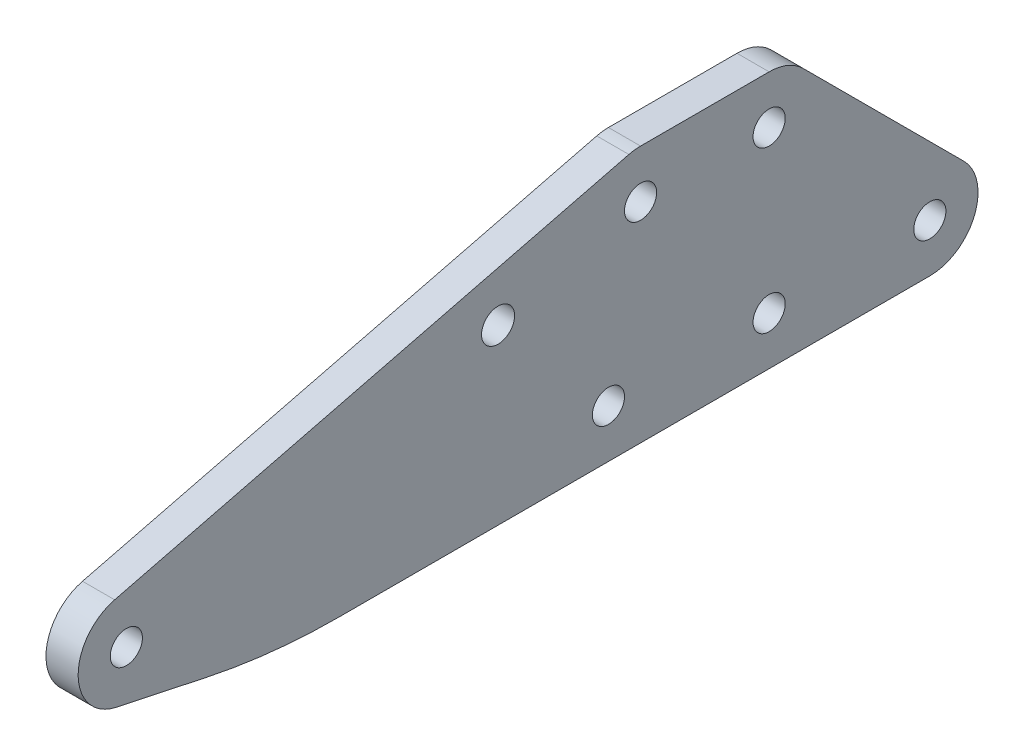
ISO-10303-21;
HEADER;
FILE_DESCRIPTION(('STEP AP214'),'2;1');
FILE_NAME('part.step','',(''),(''),'','','');
FILE_SCHEMA(('AUTOMOTIVE_DESIGN { 1 0 10303 214 1 1 1 1 }'));
ENDSEC;
DATA;
#1=APPLICATION_CONTEXT('core data for automotive mechanical design processes');
#2=APPLICATION_PROTOCOL_DEFINITION('international standard','automotive_design',2000,#1);
#3=PRODUCT_CONTEXT('',#1,'mechanical');
#4=PRODUCT('Part','Part','',(#3));
#5=PRODUCT_RELATED_PRODUCT_CATEGORY('part','',(#4));
#6=PRODUCT_DEFINITION_FORMATION('','',#4);
#7=PRODUCT_DEFINITION_CONTEXT('part definition',#1,'design');
#8=PRODUCT_DEFINITION('design','',#6,#7);
#9=PRODUCT_DEFINITION_SHAPE('','',#8);
#10=(LENGTH_UNIT() NAMED_UNIT(*) SI_UNIT(.MILLI.,.METRE.));
#11=(NAMED_UNIT(*) PLANE_ANGLE_UNIT() SI_UNIT($,.RADIAN.));
#12=(NAMED_UNIT(*) SI_UNIT($,.STERADIAN.) SOLID_ANGLE_UNIT());
#13=UNCERTAINTY_MEASURE_WITH_UNIT(LENGTH_MEASURE(1.E-05),#10,'distance_accuracy_value','');
#14=(GEOMETRIC_REPRESENTATION_CONTEXT(3) GLOBAL_UNCERTAINTY_ASSIGNED_CONTEXT((#13)) GLOBAL_UNIT_ASSIGNED_CONTEXT((#10,
#11,#12)) REPRESENTATION_CONTEXT('',''));
#15=CARTESIAN_POINT('',(0.,0.,0.));
#16=DIRECTION('',(0.,0.,1.));
#17=DIRECTION('',(1.,0.,0.));
#18=AXIS2_PLACEMENT_3D('',#15,#16,#17);
#19=CARTESIAN_POINT('',(-53.975,154.855313196237,-8.1486717009407));
#20=DIRECTION('',(0.,0.970142500145332,0.242535625036333));
#21=DIRECTION('',(0.,-0.242535625036333,0.970142500145332));
#22=AXIS2_PLACEMENT_3D('',#19,#20,#21);
#23=PLANE('',#22);
#24=DIRECTION('',(0.,-0.242535625036333,0.970142500145332));
#25=VECTOR('',#24,1.);
#26=CARTESIAN_POINT('',(-47.625,154.855313196237,-8.1486717009407));
#27=LINE('',#26,#25);
#28=CARTESIAN_POINT('',(-47.625,145.890607313884,27.7101518284711));
#29=VERTEX_POINT('',#28);
#30=CARTESIAN_POINT('',(-47.625,120.490607313884,129.310151828471));
#31=VERTEX_POINT('',#30);
#32=EDGE_CURVE('E143',#29,#31,#27,.T.);
#33=ORIENTED_EDGE('',*,*,#32,.F.);
#34=DIRECTION('',(1.,0.,0.));
#35=VECTOR('',#34,1.);
#36=CARTESIAN_POINT('',(-53.975,145.890607313884,27.7101518284711));
#37=LINE('',#36,#35);
#38=CARTESIAN_POINT('',(-53.975,145.890607313884,27.7101518284711));
#39=VERTEX_POINT('',#38);
#40=EDGE_CURVE('E11',#39,#29,#37,.T.);
#41=ORIENTED_EDGE('',*,*,#40,.F.);
#42=DIRECTION('',(0.,-0.242535625036333,0.970142500145332));
#43=VECTOR('',#42,1.);
#44=CARTESIAN_POINT('',(-53.975,154.855313196237,-8.1486717009407));
#45=LINE('',#44,#43);
#46=CARTESIAN_POINT('',(-53.975,120.490607313884,129.310151828471));
#47=VERTEX_POINT('',#46);
#48=EDGE_CURVE('E170',#39,#47,#45,.T.);
#49=ORIENTED_EDGE('',*,*,#48,.T.);
#50=DIRECTION('',(1.,0.,0.));
#51=VECTOR('',#50,1.);
#52=CARTESIAN_POINT('',(-53.975,120.490607313884,129.310151828471));
#53=LINE('',#52,#51);
#54=EDGE_CURVE('E37',#47,#31,#53,.T.);
#55=ORIENTED_EDGE('',*,*,#54,.T.);
#56=EDGE_LOOP('',(#33,#41,#49,#55));
#57=FACE_BOUND('',#56,.T.);
#58=ADVANCED_FACE('F34',(#57),#23,.T.);
#59=CARTESIAN_POINT('',(-53.975,136.65,25.4));
#60=DIRECTION('',(1.,0.,0.));
#61=DIRECTION('',(0.,0.,-1.));
#62=AXIS2_PLACEMENT_3D('',#59,#60,#61);
#63=CYLINDRICAL_SURFACE('',#62,9.52500000000002);
#64=CARTESIAN_POINT('',(-47.625,136.65,25.4));
#65=DIRECTION('',(1.,0.,0.));
#66=DIRECTION('',(0.,0.,-1.));
#67=AXIS2_PLACEMENT_3D('',#64,#65,#66);
#68=CIRCLE('',#67,9.52500000000002);
#69=CARTESIAN_POINT('',(-47.625,146.175,25.4));
#70=VERTEX_POINT('',#69);
#71=EDGE_CURVE('E168',#70,#29,#68,.T.);
#72=ORIENTED_EDGE('',*,*,#71,.F.);
#73=DIRECTION('',(1.,0.,0.));
#74=VECTOR('',#73,1.);
#75=CARTESIAN_POINT('',(-53.975,146.175,25.4));
#76=LINE('',#75,#74);
#77=CARTESIAN_POINT('',(-53.975,146.175,25.4));
#78=VERTEX_POINT('',#77);
#79=EDGE_CURVE('E43',#78,#70,#76,.T.);
#80=ORIENTED_EDGE('',*,*,#79,.F.);
#81=CARTESIAN_POINT('',(-53.975,136.65,25.4));
#82=DIRECTION('',(1.,0.,0.));
#83=DIRECTION('',(0.,0.,-1.));
#84=AXIS2_PLACEMENT_3D('',#81,#82,#83);
#85=CIRCLE('',#84,9.52500000000002);
#86=EDGE_CURVE('E133',#78,#39,#85,.T.);
#87=ORIENTED_EDGE('',*,*,#86,.T.);
#88=ORIENTED_EDGE('',*,*,#40,.T.);
#89=EDGE_LOOP('',(#72,#80,#87,#88));
#90=FACE_BOUND('',#89,.T.);
#91=ADVANCED_FACE('F186',(#90),#63,.T.);
#92=CARTESIAN_POINT('',(-53.975,146.175,0.));
#93=DIRECTION('',(0.,1.,0.));
#94=DIRECTION('',(0.,0.,1.));
#95=AXIS2_PLACEMENT_3D('',#92,#93,#94);
#96=PLANE('',#95);
#97=DIRECTION('',(0.,0.,1.));
#98=VECTOR('',#97,1.);
#99=CARTESIAN_POINT('',(-47.625,146.175,0.));
#100=LINE('',#99,#98);
#101=CARTESIAN_POINT('',(-47.625,146.175,0.));
#102=VERTEX_POINT('',#101);
#103=EDGE_CURVE('E120',#102,#70,#100,.T.);
#104=ORIENTED_EDGE('',*,*,#103,.F.);
#105=DIRECTION('',(1.,0.,0.));
#106=VECTOR('',#105,1.);
#107=CARTESIAN_POINT('',(-53.975,146.175,0.));
#108=LINE('',#107,#106);
#109=CARTESIAN_POINT('',(-53.975,146.175,0.));
#110=VERTEX_POINT('',#109);
#111=EDGE_CURVE('E115',#110,#102,#108,.T.);
#112=ORIENTED_EDGE('',*,*,#111,.F.);
#113=DIRECTION('',(0.,0.,1.));
#114=VECTOR('',#113,1.);
#115=CARTESIAN_POINT('',(-53.975,146.175,0.));
#116=LINE('',#115,#114);
#117=EDGE_CURVE('E118',#110,#78,#116,.T.);
#118=ORIENTED_EDGE('',*,*,#117,.T.);
#119=ORIENTED_EDGE('',*,*,#79,.T.);
#120=EDGE_LOOP('',(#104,#112,#118,#119));
#121=FACE_BOUND('',#120,.T.);
#122=ADVANCED_FACE('F117',(#121),#96,.T.);
#123=CARTESIAN_POINT('',(-53.975,136.65,0.));
#124=DIRECTION('',(1.,0.,0.));
#125=DIRECTION('',(0.,0.,-1.));
#126=AXIS2_PLACEMENT_3D('',#123,#124,#125);
#127=CYLINDRICAL_SURFACE('',#126,9.52500000000001);
#128=CARTESIAN_POINT('',(-47.625,136.65,0.));
#129=DIRECTION('',(1.,0.,0.));
#130=DIRECTION('',(0.,0.,-1.));
#131=AXIS2_PLACEMENT_3D('',#128,#129,#130);
#132=CIRCLE('',#131,9.52500000000001);
#133=CARTESIAN_POINT('',(-47.625,143.385192090802,-6.73519209080188));
#134=VERTEX_POINT('',#133);
#135=EDGE_CURVE('E165',#134,#102,#132,.T.);
#136=ORIENTED_EDGE('',*,*,#135,.F.);
#137=DIRECTION('',(1.,0.,0.));
#138=VECTOR('',#137,1.);
#139=CARTESIAN_POINT('',(-53.975,143.385192090802,-6.73519209080188));
#140=LINE('',#139,#138);
#141=CARTESIAN_POINT('',(-53.975,143.385192090802,-6.73519209080188));
#142=VERTEX_POINT('',#141);
#143=EDGE_CURVE('E125',#142,#134,#140,.T.);
#144=ORIENTED_EDGE('',*,*,#143,.F.);
#145=CARTESIAN_POINT('',(-53.975,136.65,0.));
#146=DIRECTION('',(1.,0.,0.));
#147=DIRECTION('',(0.,0.,-1.));
#148=AXIS2_PLACEMENT_3D('',#145,#146,#147);
#149=CIRCLE('',#148,9.52500000000001);
#150=EDGE_CURVE('E131',#142,#110,#149,.T.);
#151=ORIENTED_EDGE('',*,*,#150,.T.);
#152=ORIENTED_EDGE('',*,*,#111,.T.);
#153=EDGE_LOOP('',(#136,#144,#151,#152));
#154=FACE_BOUND('',#153,.T.);
#155=ADVANCED_FACE('F135',(#154),#127,.T.);
#156=CARTESIAN_POINT('',(-53.975,168.785192090802,18.6648079091981));
#157=DIRECTION('',(0.,0.707106781186547,-0.707106781186548));
#158=DIRECTION('',(0.,0.707106781186548,0.707106781186547));
#159=AXIS2_PLACEMENT_3D('',#156,#157,#158);
#160=PLANE('',#159);
#161=DIRECTION('',(0.,0.707106781186548,0.707106781186547));
#162=VECTOR('',#161,1.);
#163=CARTESIAN_POINT('',(-47.625,168.785192090802,18.6648079091981));
#164=LINE('',#163,#162);
#165=CARTESIAN_POINT('',(-47.625,111.635192090802,-38.4851920908019));
#166=VERTEX_POINT('',#165);
#167=EDGE_CURVE('E162',#166,#134,#164,.T.);
#168=ORIENTED_EDGE('',*,*,#167,.F.);
#169=DIRECTION('',(1.,0.,0.));
#170=VECTOR('',#169,1.);
#171=CARTESIAN_POINT('',(-53.975,111.635192090802,-38.4851920908019));
#172=LINE('',#171,#170);
#173=CARTESIAN_POINT('',(-53.975,111.635192090802,-38.4851920908019));
#174=VERTEX_POINT('',#173);
#175=EDGE_CURVE('E174',#174,#166,#172,.T.);
#176=ORIENTED_EDGE('',*,*,#175,.F.);
#177=DIRECTION('',(0.,0.707106781186548,0.707106781186547));
#178=VECTOR('',#177,1.);
#179=CARTESIAN_POINT('',(-53.975,168.785192090802,18.6648079091981));
#180=LINE('',#179,#178);
#181=EDGE_CURVE('E136',#174,#142,#180,.T.);
#182=ORIENTED_EDGE('',*,*,#181,.T.);
#183=ORIENTED_EDGE('',*,*,#143,.T.);
#184=EDGE_LOOP('',(#168,#176,#182,#183));
#185=FACE_BOUND('',#184,.T.);
#186=ADVANCED_FACE('F199',(#185),#160,.T.);
#187=CARTESIAN_POINT('',(-53.975,104.9,-31.75));
#188=DIRECTION('',(1.,0.,0.));
#189=DIRECTION('',(0.,0.,-1.));
#190=AXIS2_PLACEMENT_3D('',#187,#188,#189);
#191=CYLINDRICAL_SURFACE('',#190,9.525);
#192=CARTESIAN_POINT('',(-47.625,104.9,-31.75));
#193=DIRECTION('',(1.,0.,0.));
#194=DIRECTION('',(0.,0.,-1.));
#195=AXIS2_PLACEMENT_3D('',#192,#193,#194);
#196=CIRCLE('',#195,9.525);
#197=CARTESIAN_POINT('',(-47.625,95.375,-31.75));
#198=VERTEX_POINT('',#197);
#199=EDGE_CURVE('E159',#198,#166,#196,.T.);
#200=ORIENTED_EDGE('',*,*,#199,.F.);
#201=DIRECTION('',(1.,0.,0.));
#202=VECTOR('',#201,1.);
#203=CARTESIAN_POINT('',(-53.975,95.375,-31.75));
#204=LINE('',#203,#202);
#205=CARTESIAN_POINT('',(-53.975,95.375,-31.75));
#206=VERTEX_POINT('',#205);
#207=EDGE_CURVE('E176',#206,#198,#204,.T.);
#208=ORIENTED_EDGE('',*,*,#207,.F.);
#209=CARTESIAN_POINT('',(-53.975,104.9,-31.75));
#210=DIRECTION('',(1.,0.,0.));
#211=DIRECTION('',(0.,0.,-1.));
#212=AXIS2_PLACEMENT_3D('',#209,#210,#211);
#213=CIRCLE('',#212,9.525);
#214=EDGE_CURVE('E138',#206,#174,#213,.T.);
#215=ORIENTED_EDGE('',*,*,#214,.T.);
#216=ORIENTED_EDGE('',*,*,#175,.T.);
#217=EDGE_LOOP('',(#200,#208,#215,#216));
#218=FACE_BOUND('',#217,.T.);
#219=ADVANCED_FACE('F202',(#218),#191,.T.);
#220=CARTESIAN_POINT('',(-53.975,95.375,0.));
#221=DIRECTION('',(0.,-1.,0.));
#222=DIRECTION('',(0.,0.,-1.));
#223=AXIS2_PLACEMENT_3D('',#220,#221,#222);
#224=PLANE('',#223);
#225=DIRECTION('',(0.,0.,-1.));
#226=VECTOR('',#225,1.);
#227=CARTESIAN_POINT('',(-47.625,95.375,0.));
#228=LINE('',#227,#226);
#229=CARTESIAN_POINT('',(-47.625,95.3749999999999,84.7784787669759));
#230=VERTEX_POINT('',#229);
#231=EDGE_CURVE('E156',#230,#198,#228,.T.);
#232=ORIENTED_EDGE('',*,*,#231,.F.);
#233=DIRECTION('',(1.,0.,0.));
#234=VECTOR('',#233,1.);
#235=CARTESIAN_POINT('',(-53.975,95.3749999999999,84.7784787669759));
#236=LINE('',#235,#234);
#237=CARTESIAN_POINT('',(-53.975,95.3749999999999,84.7784787669759));
#238=VERTEX_POINT('',#237);
#239=EDGE_CURVE('E178',#238,#230,#236,.T.);
#240=ORIENTED_EDGE('',*,*,#239,.F.);
#241=DIRECTION('',(0.,0.,-1.));
#242=VECTOR('',#241,1.);
#243=CARTESIAN_POINT('',(-53.975,95.375,0.));
#244=LINE('',#243,#242);
#245=EDGE_CURVE('E312',#238,#206,#244,.T.);
#246=ORIENTED_EDGE('',*,*,#245,.T.);
#247=ORIENTED_EDGE('',*,*,#207,.T.);
#248=EDGE_LOOP('',(#232,#240,#246,#247));
#249=FACE_BOUND('',#248,.T.);
#250=ADVANCED_FACE('F206',(#249),#224,.T.);
#251=CARTESIAN_POINT('',(-53.975,222.375,84.7784787669759));
#252=DIRECTION('',(1.,0.,0.));
#253=DIRECTION('',(0.,0.,-1.));
#254=AXIS2_PLACEMENT_3D('',#251,#252,#253);
#255=CYLINDRICAL_SURFACE('',#254,127.);
#256=CARTESIAN_POINT('',(-47.625,222.375,84.7784787669759));
#257=DIRECTION('',(1.,0.,0.));
#258=DIRECTION('',(0.,0.,-1.));
#259=AXIS2_PLACEMENT_3D('',#256,#257,#258);
#260=CIRCLE('',#259,127.);
#261=CARTESIAN_POINT('',(-47.625,98.1502547068064,111.18326350083));
#262=VERTEX_POINT('',#261);
#263=EDGE_CURVE('E153',#262,#230,#260,.T.);
#264=ORIENTED_EDGE('',*,*,#263,.F.);
#265=DIRECTION('',(1.,0.,0.));
#266=VECTOR('',#265,1.);
#267=CARTESIAN_POINT('',(-53.975,98.1502547068064,111.18326350083));
#268=LINE('',#267,#266);
#269=CARTESIAN_POINT('',(-53.975,98.1502547068064,111.18326350083));
#270=VERTEX_POINT('',#269);
#271=EDGE_CURVE('E180',#270,#262,#268,.T.);
#272=ORIENTED_EDGE('',*,*,#271,.F.);
#273=CARTESIAN_POINT('',(-53.975,222.375,84.7784787669759));
#274=DIRECTION('',(1.,0.,0.));
#275=DIRECTION('',(0.,0.,-1.));
#276=AXIS2_PLACEMENT_3D('',#273,#274,#275);
#277=CIRCLE('',#276,127.);
#278=EDGE_CURVE('E309',#270,#238,#277,.T.);
#279=ORIENTED_EDGE('',*,*,#278,.T.);
#280=ORIENTED_EDGE('',*,*,#239,.T.);
#281=EDGE_LOOP('',(#264,#272,#279,#280));
#282=FACE_BOUND('',#281,.T.);
#283=ADVANCED_FACE('F210',(#282),#255,.T.);
#284=CARTESIAN_POINT('',(-53.975,79.3992853315146,22.9668883959212));
#285=DIRECTION('',(0.,-0.978147600733807,0.207911690817753));
#286=DIRECTION('',(0.,-0.207911690817753,-0.978147600733807));
#287=AXIS2_PLACEMENT_3D('',#284,#285,#286);
#288=PLANE('',#287);
#289=DIRECTION('',(0.,-0.207911690817753,-0.978147600733807));
#290=VECTOR('',#289,1.);
#291=CARTESIAN_POINT('',(-47.625,79.3992853315146,22.9668883959212));
#292=LINE('',#291,#290);
#293=CARTESIAN_POINT('',(-47.625,101.93314410301,128.980358855039));
#294=VERTEX_POINT('',#293);
#295=EDGE_CURVE('E150',#294,#262,#292,.T.);
#296=ORIENTED_EDGE('',*,*,#295,.F.);
#297=DIRECTION('',(1.,0.,0.));
#298=VECTOR('',#297,1.);
#299=CARTESIAN_POINT('',(-53.975,101.93314410301,128.980358855039));
#300=LINE('',#299,#298);
#301=CARTESIAN_POINT('',(-53.975,101.93314410301,128.980358855039));
#302=VERTEX_POINT('',#301);
#303=EDGE_CURVE('E181',#302,#294,#300,.T.);
#304=ORIENTED_EDGE('',*,*,#303,.F.);
#305=DIRECTION('',(0.,-0.207911690817753,-0.978147600733807));
#306=VECTOR('',#305,1.);
#307=CARTESIAN_POINT('',(-53.975,79.3992853315146,22.9668883959212));
#308=LINE('',#307,#306);
#309=EDGE_CURVE('E306',#302,#270,#308,.T.);
#310=ORIENTED_EDGE('',*,*,#309,.T.);
#311=ORIENTED_EDGE('',*,*,#271,.T.);
#312=EDGE_LOOP('',(#296,#304,#310,#311));
#313=FACE_BOUND('',#312,.T.);
#314=ADVANCED_FACE('F214',(#313),#288,.T.);
#315=CARTESIAN_POINT('',(-53.975,111.25,127.));
#316=DIRECTION('',(1.,0.,0.));
#317=DIRECTION('',(0.,0.,-1.));
#318=AXIS2_PLACEMENT_3D('',#315,#316,#317);
#319=CYLINDRICAL_SURFACE('',#318,9.52499999999999);
#320=CARTESIAN_POINT('',(-47.625,111.25,127.));
#321=DIRECTION('',(1.,0.,0.));
#322=DIRECTION('',(0.,0.,-1.));
#323=AXIS2_PLACEMENT_3D('',#320,#321,#322);
#324=CIRCLE('',#323,9.52499999999999);
#325=EDGE_CURVE('E146',#31,#294,#324,.T.);
#326=ORIENTED_EDGE('',*,*,#325,.F.);
#327=ORIENTED_EDGE('',*,*,#54,.F.);
#328=CARTESIAN_POINT('',(-53.975,111.25,127.));
#329=DIRECTION('',(1.,0.,0.));
#330=DIRECTION('',(0.,0.,-1.));
#331=AXIS2_PLACEMENT_3D('',#328,#329,#330);
#332=CIRCLE('',#331,9.52499999999999);
#333=EDGE_CURVE('E304',#47,#302,#332,.T.);
#334=ORIENTED_EDGE('',*,*,#333,.T.);
#335=ORIENTED_EDGE('',*,*,#303,.T.);
#336=EDGE_LOOP('',(#326,#327,#334,#335));
#337=FACE_BOUND('',#336,.T.);
#338=ADVANCED_FACE('F183',(#337),#319,.T.);
#339=CARTESIAN_POINT('',(-53.975,111.25,127.));
#340=DIRECTION('',(1.,0.,0.));
#341=DIRECTION('',(0.,0.,-1.));
#342=AXIS2_PLACEMENT_3D('',#339,#340,#341);
#343=PLANE('',#342);
#344=CARTESIAN_POINT('',(-53.975,136.65,0.));
#345=DIRECTION('',(1.,0.,0.));
#346=DIRECTION('',(0.,0.,-1.));
#347=AXIS2_PLACEMENT_3D('',#344,#345,#346);
#348=CIRCLE('',#347,3.17499999999999);
#349=CARTESIAN_POINT('',(-53.975,136.65,-3.175));
#350=VERTEX_POINT('',#349);
#351=EDGE_CURVE('E261',#350,#350,#348,.T.);
#352=ORIENTED_EDGE('',*,*,#351,.T.);
#353=EDGE_LOOP('',(#352));
#354=FACE_BOUND('',#353,.T.);
#355=CARTESIAN_POINT('',(-53.975,136.65,25.4));
#356=DIRECTION('',(1.,0.,0.));
#357=DIRECTION('',(0.,0.,-1.));
#358=AXIS2_PLACEMENT_3D('',#355,#356,#357);
#359=CIRCLE('',#358,3.17499999999997);
#360=CARTESIAN_POINT('',(-53.975,136.65,22.225));
#361=VERTEX_POINT('',#360);
#362=EDGE_CURVE('E269',#361,#361,#359,.T.);
#363=ORIENTED_EDGE('',*,*,#362,.T.);
#364=EDGE_LOOP('',(#363));
#365=FACE_BOUND('',#364,.T.);
#366=CARTESIAN_POINT('',(-53.975,104.9,-31.75));
#367=DIRECTION('',(1.,0.,0.));
#368=DIRECTION('',(0.,0.,-1.));
#369=AXIS2_PLACEMENT_3D('',#366,#367,#368);
#370=CIRCLE('',#369,3.175);
#371=CARTESIAN_POINT('',(-53.975,104.9,-34.925));
#372=VERTEX_POINT('',#371);
#373=EDGE_CURVE('E275',#372,#372,#370,.T.);
#374=ORIENTED_EDGE('',*,*,#373,.T.);
#375=EDGE_LOOP('',(#374));
#376=FACE_BOUND('',#375,.T.);
#377=CARTESIAN_POINT('',(-53.975,104.9,0.));
#378=DIRECTION('',(1.,0.,0.));
#379=DIRECTION('',(0.,0.,-1.));
#380=AXIS2_PLACEMENT_3D('',#377,#378,#379);
#381=CIRCLE('',#380,3.17499999999999);
#382=CARTESIAN_POINT('',(-53.975,104.9,-3.17499999999999));
#383=VERTEX_POINT('',#382);
#384=EDGE_CURVE('E281',#383,#383,#381,.T.);
#385=ORIENTED_EDGE('',*,*,#384,.T.);
#386=EDGE_LOOP('',(#385));
#387=FACE_BOUND('',#386,.T.);
#388=CARTESIAN_POINT('',(-53.975,104.9,31.75));
#389=DIRECTION('',(1.,0.,0.));
#390=DIRECTION('',(0.,0.,-1.));
#391=AXIS2_PLACEMENT_3D('',#388,#389,#390);
#392=CIRCLE('',#391,3.175);
#393=CARTESIAN_POINT('',(-53.975,104.9,28.575));
#394=VERTEX_POINT('',#393);
#395=EDGE_CURVE('E287',#394,#394,#392,.T.);
#396=ORIENTED_EDGE('',*,*,#395,.T.);
#397=EDGE_LOOP('',(#396));
#398=FACE_BOUND('',#397,.T.);
#399=CARTESIAN_POINT('',(-53.975,129.61045115148,53.5581953940812));
#400=DIRECTION('',(1.,0.,0.));
#401=DIRECTION('',(0.,0.,-1.));
#402=AXIS2_PLACEMENT_3D('',#399,#400,#401);
#403=CIRCLE('',#402,3.26389999999999);
#404=CARTESIAN_POINT('',(-53.975,129.61045115148,50.2942953940812));
#405=VERTEX_POINT('',#404);
#406=EDGE_CURVE('E293',#405,#405,#403,.T.);
#407=ORIENTED_EDGE('',*,*,#406,.T.);
#408=EDGE_LOOP('',(#407));
#409=FACE_BOUND('',#408,.T.);
#410=CARTESIAN_POINT('',(-53.975,111.25,127.));
#411=DIRECTION('',(1.,0.,0.));
#412=DIRECTION('',(0.,0.,-1.));
#413=AXIS2_PLACEMENT_3D('',#410,#411,#412);
#414=CIRCLE('',#413,3.17499999999997);
#415=CARTESIAN_POINT('',(-53.975,111.25,123.825));
#416=VERTEX_POINT('',#415);
#417=EDGE_CURVE('E147',#416,#416,#414,.T.);
#418=ORIENTED_EDGE('',*,*,#417,.T.);
#419=EDGE_LOOP('',(#418));
#420=FACE_BOUND('',#419,.T.);
#421=ORIENTED_EDGE('',*,*,#48,.F.);
#422=ORIENTED_EDGE('',*,*,#86,.F.);
#423=ORIENTED_EDGE('',*,*,#117,.F.);
#424=ORIENTED_EDGE('',*,*,#150,.F.);
#425=ORIENTED_EDGE('',*,*,#181,.F.);
#426=ORIENTED_EDGE('',*,*,#214,.F.);
#427=ORIENTED_EDGE('',*,*,#245,.F.);
#428=ORIENTED_EDGE('',*,*,#278,.F.);
#429=ORIENTED_EDGE('',*,*,#309,.F.);
#430=ORIENTED_EDGE('',*,*,#333,.F.);
#431=EDGE_LOOP('',(#421,#422,#423,#424,#425,#426,#427,#428,#429,#430));
#432=FACE_BOUND('',#431,.T.);
#433=ADVANCED_FACE('F129',(#354,#365,#376,#387,#398,#409,#420,#432),#343,.F.);
#434=CARTESIAN_POINT('',(-47.625,111.25,127.));
#435=DIRECTION('',(1.,0.,0.));
#436=DIRECTION('',(0.,0.,-1.));
#437=AXIS2_PLACEMENT_3D('',#434,#435,#436);
#438=PLANE('',#437);
#439=CARTESIAN_POINT('',(-47.625,136.65,0.));
#440=DIRECTION('',(1.,0.,0.));
#441=DIRECTION('',(0.,0.,-1.));
#442=AXIS2_PLACEMENT_3D('',#439,#440,#441);
#443=CIRCLE('',#442,3.17499999999999);
#444=CARTESIAN_POINT('',(-47.625,136.65,-3.175));
#445=VERTEX_POINT('',#444);
#446=EDGE_CURVE('E264',#445,#445,#443,.T.);
#447=ORIENTED_EDGE('',*,*,#446,.F.);
#448=EDGE_LOOP('',(#447));
#449=FACE_BOUND('',#448,.T.);
#450=CARTESIAN_POINT('',(-47.625,136.65,25.4));
#451=DIRECTION('',(1.,0.,0.));
#452=DIRECTION('',(0.,0.,-1.));
#453=AXIS2_PLACEMENT_3D('',#450,#451,#452);
#454=CIRCLE('',#453,3.17499999999997);
#455=CARTESIAN_POINT('',(-47.625,136.65,22.225));
#456=VERTEX_POINT('',#455);
#457=EDGE_CURVE('E266',#456,#456,#454,.T.);
#458=ORIENTED_EDGE('',*,*,#457,.F.);
#459=EDGE_LOOP('',(#458));
#460=FACE_BOUND('',#459,.T.);
#461=CARTESIAN_POINT('',(-47.625,104.9,-31.75));
#462=DIRECTION('',(1.,0.,0.));
#463=DIRECTION('',(0.,0.,-1.));
#464=AXIS2_PLACEMENT_3D('',#461,#462,#463);
#465=CIRCLE('',#464,3.175);
#466=CARTESIAN_POINT('',(-47.625,104.9,-34.925));
#467=VERTEX_POINT('',#466);
#468=EDGE_CURVE('E272',#467,#467,#465,.T.);
#469=ORIENTED_EDGE('',*,*,#468,.F.);
#470=EDGE_LOOP('',(#469));
#471=FACE_BOUND('',#470,.T.);
#472=CARTESIAN_POINT('',(-47.625,104.9,0.));
#473=DIRECTION('',(1.,0.,0.));
#474=DIRECTION('',(0.,0.,-1.));
#475=AXIS2_PLACEMENT_3D('',#472,#473,#474);
#476=CIRCLE('',#475,3.17499999999999);
#477=CARTESIAN_POINT('',(-47.625,104.9,-3.17499999999999));
#478=VERTEX_POINT('',#477);
#479=EDGE_CURVE('E278',#478,#478,#476,.T.);
#480=ORIENTED_EDGE('',*,*,#479,.F.);
#481=EDGE_LOOP('',(#480));
#482=FACE_BOUND('',#481,.T.);
#483=CARTESIAN_POINT('',(-47.625,104.9,31.75));
#484=DIRECTION('',(1.,0.,0.));
#485=DIRECTION('',(0.,0.,-1.));
#486=AXIS2_PLACEMENT_3D('',#483,#484,#485);
#487=CIRCLE('',#486,3.175);
#488=CARTESIAN_POINT('',(-47.625,104.9,28.575));
#489=VERTEX_POINT('',#488);
#490=EDGE_CURVE('E284',#489,#489,#487,.T.);
#491=ORIENTED_EDGE('',*,*,#490,.F.);
#492=EDGE_LOOP('',(#491));
#493=FACE_BOUND('',#492,.T.);
#494=CARTESIAN_POINT('',(-47.625,129.61045115148,53.5581953940812));
#495=DIRECTION('',(1.,0.,0.));
#496=DIRECTION('',(0.,0.,-1.));
#497=AXIS2_PLACEMENT_3D('',#494,#495,#496);
#498=CIRCLE('',#497,3.26389999999999);
#499=CARTESIAN_POINT('',(-47.625,129.61045115148,50.2942953940812));
#500=VERTEX_POINT('',#499);
#501=EDGE_CURVE('E290',#500,#500,#498,.T.);
#502=ORIENTED_EDGE('',*,*,#501,.F.);
#503=EDGE_LOOP('',(#502));
#504=FACE_BOUND('',#503,.T.);
#505=CARTESIAN_POINT('',(-47.625,111.25,127.));
#506=DIRECTION('',(1.,0.,0.));
#507=DIRECTION('',(0.,0.,-1.));
#508=AXIS2_PLACEMENT_3D('',#505,#506,#507);
#509=CIRCLE('',#508,3.17499999999997);
#510=CARTESIAN_POINT('',(-47.625,111.25,123.825));
#511=VERTEX_POINT('',#510);
#512=EDGE_CURVE('E296',#511,#511,#509,.T.);
#513=ORIENTED_EDGE('',*,*,#512,.F.);
#514=EDGE_LOOP('',(#513));
#515=FACE_BOUND('',#514,.T.);
#516=ORIENTED_EDGE('',*,*,#32,.T.);
#517=ORIENTED_EDGE('',*,*,#325,.T.);
#518=ORIENTED_EDGE('',*,*,#295,.T.);
#519=ORIENTED_EDGE('',*,*,#263,.T.);
#520=ORIENTED_EDGE('',*,*,#231,.T.);
#521=ORIENTED_EDGE('',*,*,#199,.T.);
#522=ORIENTED_EDGE('',*,*,#167,.T.);
#523=ORIENTED_EDGE('',*,*,#135,.T.);
#524=ORIENTED_EDGE('',*,*,#103,.T.);
#525=ORIENTED_EDGE('',*,*,#71,.T.);
#526=EDGE_LOOP('',(#516,#517,#518,#519,#520,#521,#522,#523,#524,#525));
#527=FACE_BOUND('',#526,.T.);
#528=ADVANCED_FACE('F185',(#449,#460,#471,#482,#493,#504,#515,#527),#438,.T.);
#529=CARTESIAN_POINT('',(-53.975,111.25,127.));
#530=DIRECTION('',(1.,0.,0.));
#531=DIRECTION('',(0.,0.,-1.));
#532=AXIS2_PLACEMENT_3D('',#529,#530,#531);
#533=CYLINDRICAL_SURFACE('',#532,3.17499999999997);
#534=ORIENTED_EDGE('',*,*,#417,.F.);
#535=EDGE_LOOP('',(#534));
#536=FACE_BOUND('',#535,.T.);
#537=ORIENTED_EDGE('',*,*,#512,.T.);
#538=EDGE_LOOP('',(#537));
#539=FACE_BOUND('',#538,.T.);
#540=ADVANCED_FACE('F226',(#536,#539),#533,.F.);
#541=CARTESIAN_POINT('',(-53.975,129.61045115148,53.5581953940812));
#542=DIRECTION('',(1.,0.,0.));
#543=DIRECTION('',(0.,0.,-1.));
#544=AXIS2_PLACEMENT_3D('',#541,#542,#543);
#545=CYLINDRICAL_SURFACE('',#544,3.26389999999999);
#546=ORIENTED_EDGE('',*,*,#406,.F.);
#547=EDGE_LOOP('',(#546));
#548=FACE_BOUND('',#547,.T.);
#549=ORIENTED_EDGE('',*,*,#501,.T.);
#550=EDGE_LOOP('',(#549));
#551=FACE_BOUND('',#550,.T.);
#552=ADVANCED_FACE('F233',(#548,#551),#545,.F.);
#553=CARTESIAN_POINT('',(-53.975,104.9,31.75));
#554=DIRECTION('',(1.,0.,0.));
#555=DIRECTION('',(0.,0.,-1.));
#556=AXIS2_PLACEMENT_3D('',#553,#554,#555);
#557=CYLINDRICAL_SURFACE('',#556,3.175);
#558=ORIENTED_EDGE('',*,*,#395,.F.);
#559=EDGE_LOOP('',(#558));
#560=FACE_BOUND('',#559,.T.);
#561=ORIENTED_EDGE('',*,*,#490,.T.);
#562=EDGE_LOOP('',(#561));
#563=FACE_BOUND('',#562,.T.);
#564=ADVANCED_FACE('F237',(#560,#563),#557,.F.);
#565=CARTESIAN_POINT('',(-53.975,104.9,0.));
#566=DIRECTION('',(1.,0.,0.));
#567=DIRECTION('',(0.,0.,-1.));
#568=AXIS2_PLACEMENT_3D('',#565,#566,#567);
#569=CYLINDRICAL_SURFACE('',#568,3.17499999999999);
#570=ORIENTED_EDGE('',*,*,#384,.F.);
#571=EDGE_LOOP('',(#570));
#572=FACE_BOUND('',#571,.T.);
#573=ORIENTED_EDGE('',*,*,#479,.T.);
#574=EDGE_LOOP('',(#573));
#575=FACE_BOUND('',#574,.T.);
#576=ADVANCED_FACE('F241',(#572,#575),#569,.F.);
#577=CARTESIAN_POINT('',(-53.975,104.9,-31.75));
#578=DIRECTION('',(1.,0.,0.));
#579=DIRECTION('',(0.,0.,-1.));
#580=AXIS2_PLACEMENT_3D('',#577,#578,#579);
#581=CYLINDRICAL_SURFACE('',#580,3.175);
#582=ORIENTED_EDGE('',*,*,#373,.F.);
#583=EDGE_LOOP('',(#582));
#584=FACE_BOUND('',#583,.T.);
#585=ORIENTED_EDGE('',*,*,#468,.T.);
#586=EDGE_LOOP('',(#585));
#587=FACE_BOUND('',#586,.T.);
#588=ADVANCED_FACE('F245',(#584,#587),#581,.F.);
#589=CARTESIAN_POINT('',(-53.975,136.65,25.4));
#590=DIRECTION('',(1.,0.,0.));
#591=DIRECTION('',(0.,0.,-1.));
#592=AXIS2_PLACEMENT_3D('',#589,#590,#591);
#593=CYLINDRICAL_SURFACE('',#592,3.17499999999997);
#594=ORIENTED_EDGE('',*,*,#362,.F.);
#595=EDGE_LOOP('',(#594));
#596=FACE_BOUND('',#595,.T.);
#597=ORIENTED_EDGE('',*,*,#457,.T.);
#598=EDGE_LOOP('',(#597));
#599=FACE_BOUND('',#598,.T.);
#600=ADVANCED_FACE('F249',(#596,#599),#593,.F.);
#601=CARTESIAN_POINT('',(-53.975,136.65,0.));
#602=DIRECTION('',(1.,0.,0.));
#603=DIRECTION('',(0.,0.,-1.));
#604=AXIS2_PLACEMENT_3D('',#601,#602,#603);
#605=CYLINDRICAL_SURFACE('',#604,3.17499999999999);
#606=ORIENTED_EDGE('',*,*,#351,.F.);
#607=EDGE_LOOP('',(#606));
#608=FACE_BOUND('',#607,.T.);
#609=ORIENTED_EDGE('',*,*,#446,.T.);
#610=EDGE_LOOP('',(#609));
#611=FACE_BOUND('',#610,.T.);
#612=ADVANCED_FACE('F253',(#608,#611),#605,.F.);
#613=CLOSED_SHELL('',(#58,#91,#122,#155,#186,#219,#250,#283,#314,#338,#433,#528,#540,#552,#564,
#576,#588,#600,#612));
#614=MANIFOLD_SOLID_BREP('B2',#613);
#615=ADVANCED_BREP_SHAPE_REPRESENTATION('',(#18,#614),#14);
#616=SHAPE_DEFINITION_REPRESENTATION(#9,#615);
ENDSEC;
END-ISO-10303-21;
